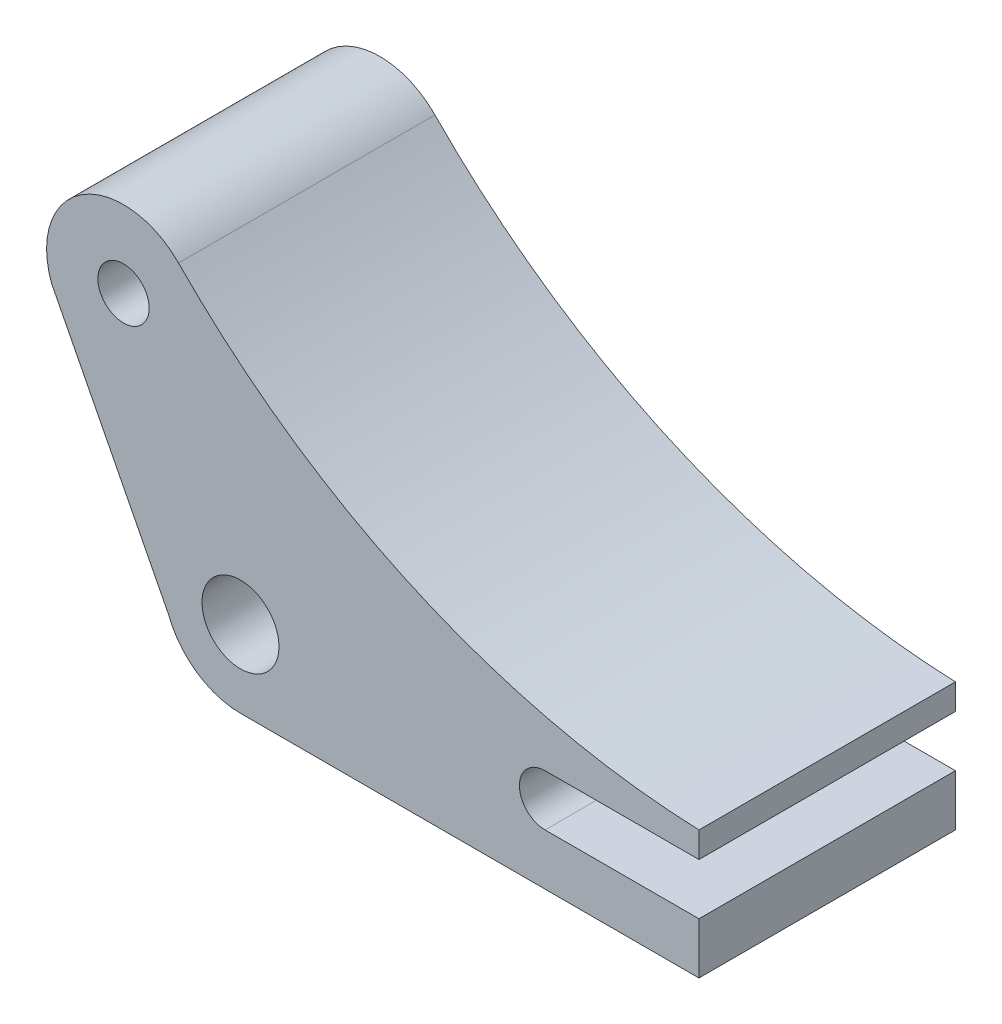
ISO-10303-21;
HEADER;
FILE_DESCRIPTION(('STEP AP214'),'2;1');
FILE_NAME('part.step','',(''),(''),'','','');
FILE_SCHEMA(('AUTOMOTIVE_DESIGN { 1 0 10303 214 1 1 1 1 }'));
ENDSEC;
DATA;
#1=APPLICATION_CONTEXT('core data for automotive mechanical design processes');
#2=APPLICATION_PROTOCOL_DEFINITION('international standard','automotive_design',2000,#1);
#3=PRODUCT_CONTEXT('',#1,'mechanical');
#4=PRODUCT('Part','Part','',(#3));
#5=PRODUCT_RELATED_PRODUCT_CATEGORY('part','',(#4));
#6=PRODUCT_DEFINITION_FORMATION('','',#4);
#7=PRODUCT_DEFINITION_CONTEXT('part definition',#1,'design');
#8=PRODUCT_DEFINITION('design','',#6,#7);
#9=PRODUCT_DEFINITION_SHAPE('','',#8);
#10=(LENGTH_UNIT() NAMED_UNIT(*) SI_UNIT(.MILLI.,.METRE.));
#11=(NAMED_UNIT(*) PLANE_ANGLE_UNIT() SI_UNIT($,.RADIAN.));
#12=(NAMED_UNIT(*) SI_UNIT($,.STERADIAN.) SOLID_ANGLE_UNIT());
#13=UNCERTAINTY_MEASURE_WITH_UNIT(LENGTH_MEASURE(1.E-05),#10,'distance_accuracy_value','');
#14=(GEOMETRIC_REPRESENTATION_CONTEXT(3) GLOBAL_UNCERTAINTY_ASSIGNED_CONTEXT((#13)) GLOBAL_UNIT_ASSIGNED_CONTEXT((#10,
#11,#12)) REPRESENTATION_CONTEXT('',''));
#15=CARTESIAN_POINT('',(0.,0.,0.));
#16=DIRECTION('',(0.,0.,1.));
#17=DIRECTION('',(1.,0.,0.));
#18=AXIS2_PLACEMENT_3D('',#15,#16,#17);
#19=CARTESIAN_POINT('',(190.2604220826,319.779554442761,50.));
#20=DIRECTION('',(0.,0.,-1.));
#21=DIRECTION('',(-1.,0.,0.));
#22=AXIS2_PLACEMENT_3D('',#19,#20,#21);
#23=CYLINDRICAL_SURFACE('',#22,300.);
#24=CARTESIAN_POINT('',(190.2604220826,319.779554442761,-50.));
#25=DIRECTION('',(0.,0.,1.));
#26=DIRECTION('',(1.,0.,0.));
#27=AXIS2_PLACEMENT_3D('',#24,#25,#26);
#28=CIRCLE('',#27,300.);
#29=CARTESIAN_POINT('',(-24.1706258147925,109.971724041639,-50.));
#30=VERTEX_POINT('',#29);
#31=CARTESIAN_POINT('',(178.761781375989,20.,-50.));
#32=VERTEX_POINT('',#31);
#33=EDGE_CURVE('E175',#30,#32,#28,.T.);
#34=ORIENTED_EDGE('',*,*,#33,.F.);
#35=DIRECTION('',(0.,0.,-1.));
#36=VECTOR('',#35,1.);
#37=CARTESIAN_POINT('',(-24.1706258147925,109.971724041639,50.));
#38=LINE('',#37,#36);
#39=CARTESIAN_POINT('',(-24.1706258147925,109.971724041639,50.));
#40=VERTEX_POINT('',#39);
#41=EDGE_CURVE('E11',#40,#30,#38,.T.);
#42=ORIENTED_EDGE('',*,*,#41,.F.);
#43=CARTESIAN_POINT('',(190.2604220826,319.779554442761,50.));
#44=DIRECTION('',(0.,0.,1.));
#45=DIRECTION('',(1.,0.,0.));
#46=AXIS2_PLACEMENT_3D('',#43,#44,#45);
#47=CIRCLE('',#46,300.);
#48=CARTESIAN_POINT('',(178.761781375989,20.,50.));
#49=VERTEX_POINT('',#48);
#50=EDGE_CURVE('E256',#40,#49,#47,.T.);
#51=ORIENTED_EDGE('',*,*,#50,.T.);
#52=DIRECTION('',(0.,0.,-1.));
#53=VECTOR('',#52,1.);
#54=CARTESIAN_POINT('',(178.761781375989,20.,50.));
#55=LINE('',#54,#53);
#56=EDGE_CURVE('E98',#49,#32,#55,.T.);
#57=ORIENTED_EDGE('',*,*,#56,.T.);
#58=EDGE_LOOP('',(#34,#42,#51,#57));
#59=FACE_BOUND('',#58,.T.);
#60=ADVANCED_FACE('F41',(#59),#23,.F.);
#61=CARTESIAN_POINT('',(-45.6137306045318,88.9909410015267,50.));
#62=DIRECTION('',(0.,0.,-1.));
#63=DIRECTION('',(-1.,0.,0.));
#64=AXIS2_PLACEMENT_3D('',#61,#62,#63);
#65=CYLINDRICAL_SURFACE('',#64,30.);
#66=CARTESIAN_POINT('',(-45.6137306045318,88.9909410015267,-50.));
#67=DIRECTION('',(0.,0.,1.));
#68=DIRECTION('',(1.,0.,0.));
#69=AXIS2_PLACEMENT_3D('',#66,#67,#68);
#70=CIRCLE('',#69,30.);
#71=CARTESIAN_POINT('',(-73.630323726117,78.2638486713774,-50.));
#72=VERTEX_POINT('',#71);
#73=EDGE_CURVE('E173',#30,#72,#70,.T.);
#74=ORIENTED_EDGE('',*,*,#73,.T.);
#75=DIRECTION('',(0.,0.,-1.));
#76=VECTOR('',#75,1.);
#77=CARTESIAN_POINT('',(-73.630323726117,78.2638486713774,50.));
#78=LINE('',#77,#76);
#79=CARTESIAN_POINT('',(-73.630323726117,78.2638486713774,50.));
#80=VERTEX_POINT('',#79);
#81=EDGE_CURVE('E50',#80,#72,#78,.T.);
#82=ORIENTED_EDGE('',*,*,#81,.F.);
#83=CARTESIAN_POINT('',(-45.6137306045318,88.9909410015267,50.));
#84=DIRECTION('',(0.,0.,1.));
#85=DIRECTION('',(1.,0.,0.));
#86=AXIS2_PLACEMENT_3D('',#83,#84,#85);
#87=CIRCLE('',#86,30.);
#88=EDGE_CURVE('E258',#40,#80,#87,.T.);
#89=ORIENTED_EDGE('',*,*,#88,.F.);
#90=ORIENTED_EDGE('',*,*,#41,.T.);
#91=EDGE_LOOP('',(#74,#82,#89,#90));
#92=FACE_BOUND('',#91,.T.);
#93=ADVANCED_FACE('F174',(#92),#65,.T.);
#94=CARTESIAN_POINT('',(-26.5417767292878,-13.6044123128735,50.));
#95=DIRECTION('',(-0.889909410015267,-0.456137306045318,0.));
#96=DIRECTION('',(0.456137306045318,-0.889909410015267,0.));
#97=AXIS2_PLACEMENT_3D('',#94,#95,#96);
#98=PLANE('',#97);
#99=DIRECTION('',(-0.456137306045318,0.889909410015267,0.));
#100=VECTOR('',#99,1.);
#101=CARTESIAN_POINT('',(-26.5417767292878,-13.6044123128735,-50.));
#102=LINE('',#101,#100);
#103=CARTESIAN_POINT('',(-28.0165931215852,-10.7270923301491,-50.));
#104=VERTEX_POINT('',#103);
#105=EDGE_CURVE('E167',#104,#72,#102,.T.);
#106=ORIENTED_EDGE('',*,*,#105,.F.);
#107=DIRECTION('',(0.,0.,-1.));
#108=VECTOR('',#107,1.);
#109=CARTESIAN_POINT('',(-28.0165931215852,-10.7270923301491,50.));
#110=LINE('',#109,#108);
#111=CARTESIAN_POINT('',(-28.0165931215852,-10.7270923301491,50.));
#112=VERTEX_POINT('',#111);
#113=EDGE_CURVE('E159',#112,#104,#110,.T.);
#114=ORIENTED_EDGE('',*,*,#113,.F.);
#115=DIRECTION('',(-0.456137306045318,0.889909410015267,0.));
#116=VECTOR('',#115,1.);
#117=CARTESIAN_POINT('',(-26.5417767292878,-13.6044123128735,50.));
#118=LINE('',#117,#116);
#119=EDGE_CURVE('E170',#112,#80,#118,.T.);
#120=ORIENTED_EDGE('',*,*,#119,.T.);
#121=ORIENTED_EDGE('',*,*,#81,.T.);
#122=EDGE_LOOP('',(#106,#114,#120,#121));
#123=FACE_BOUND('',#122,.T.);
#124=ADVANCED_FACE('F165',(#123),#98,.T.);
#125=CARTESIAN_POINT('',(0.,0.,50.));
#126=DIRECTION('',(0.,0.,-1.));
#127=DIRECTION('',(-1.,0.,0.));
#128=AXIS2_PLACEMENT_3D('',#125,#126,#127);
#129=CYLINDRICAL_SURFACE('',#128,30.);
#130=CARTESIAN_POINT('',(0.,0.,-50.));
#131=DIRECTION('',(0.,0.,1.));
#132=DIRECTION('',(1.,0.,0.));
#133=AXIS2_PLACEMENT_3D('',#130,#131,#132);
#134=CIRCLE('',#133,30.);
#135=CARTESIAN_POINT('',(0.,-30.,-50.));
#136=VERTEX_POINT('',#135);
#137=EDGE_CURVE('E181',#136,#104,#134,.F.);
#138=ORIENTED_EDGE('',*,*,#137,.F.);
#139=DIRECTION('',(0.,0.,-1.));
#140=VECTOR('',#139,1.);
#141=CARTESIAN_POINT('',(0.,-30.,50.));
#142=LINE('',#141,#140);
#143=CARTESIAN_POINT('',(0.,-30.,50.));
#144=VERTEX_POINT('',#143);
#145=EDGE_CURVE('E157',#144,#136,#142,.T.);
#146=ORIENTED_EDGE('',*,*,#145,.F.);
#147=CARTESIAN_POINT('',(0.,0.,50.));
#148=DIRECTION('',(0.,0.,1.));
#149=DIRECTION('',(1.,0.,0.));
#150=AXIS2_PLACEMENT_3D('',#147,#148,#149);
#151=CIRCLE('',#150,30.);
#152=EDGE_CURVE('E263',#144,#112,#151,.F.);
#153=ORIENTED_EDGE('',*,*,#152,.T.);
#154=ORIENTED_EDGE('',*,*,#113,.T.);
#155=EDGE_LOOP('',(#138,#146,#153,#154));
#156=FACE_BOUND('',#155,.T.);
#157=ADVANCED_FACE('F219',(#156),#129,.T.);
#158=CARTESIAN_POINT('',(0.,-30.,50.));
#159=DIRECTION('',(0.,1.,0.));
#160=DIRECTION('',(0.,0.,1.));
#161=AXIS2_PLACEMENT_3D('',#158,#159,#160);
#162=PLANE('',#161);
#163=DIRECTION('',(1.,0.,0.));
#164=VECTOR('',#163,1.);
#165=CARTESIAN_POINT('',(0.,-30.,-50.));
#166=LINE('',#165,#164);
#167=CARTESIAN_POINT('',(178.761781375989,-30.,-50.));
#168=VERTEX_POINT('',#167);
#169=EDGE_CURVE('E183',#136,#168,#166,.T.);
#170=ORIENTED_EDGE('',*,*,#169,.T.);
#171=DIRECTION('',(0.,0.,-1.));
#172=VECTOR('',#171,1.);
#173=CARTESIAN_POINT('',(178.761781375989,-30.,50.));
#174=LINE('',#173,#172);
#175=CARTESIAN_POINT('',(178.761781375989,-30.,50.));
#176=VERTEX_POINT('',#175);
#177=EDGE_CURVE('E154',#176,#168,#174,.T.);
#178=ORIENTED_EDGE('',*,*,#177,.F.);
#179=DIRECTION('',(1.,0.,0.));
#180=VECTOR('',#179,1.);
#181=CARTESIAN_POINT('',(0.,-30.,50.));
#182=LINE('',#181,#180);
#183=EDGE_CURVE('E266',#144,#176,#182,.T.);
#184=ORIENTED_EDGE('',*,*,#183,.F.);
#185=ORIENTED_EDGE('',*,*,#145,.T.);
#186=EDGE_LOOP('',(#170,#178,#184,#185));
#187=FACE_BOUND('',#186,.T.);
#188=ADVANCED_FACE('F222',(#187),#162,.F.);
#189=CARTESIAN_POINT('',(178.761781375989,0.,50.));
#190=DIRECTION('',(-1.,0.,0.));
#191=DIRECTION('',(0.,0.,1.));
#192=AXIS2_PLACEMENT_3D('',#189,#190,#191);
#193=PLANE('',#192);
#194=DIRECTION('',(0.,1.,0.));
#195=VECTOR('',#194,1.);
#196=CARTESIAN_POINT('',(178.761781375989,0.,-50.));
#197=LINE('',#196,#195);
#198=CARTESIAN_POINT('',(178.761781375989,-10.,-50.));
#199=VERTEX_POINT('',#198);
#200=EDGE_CURVE('E189',#168,#199,#197,.T.);
#201=ORIENTED_EDGE('',*,*,#200,.T.);
#202=DIRECTION('',(0.,0.,-1.));
#203=VECTOR('',#202,1.);
#204=CARTESIAN_POINT('',(178.761781375989,-10.,50.));
#205=LINE('',#204,#203);
#206=CARTESIAN_POINT('',(178.761781375989,-10.,50.));
#207=VERTEX_POINT('',#206);
#208=EDGE_CURVE('E147',#207,#199,#205,.T.);
#209=ORIENTED_EDGE('',*,*,#208,.F.);
#210=DIRECTION('',(0.,1.,0.));
#211=VECTOR('',#210,1.);
#212=CARTESIAN_POINT('',(178.761781375989,0.,50.));
#213=LINE('',#212,#211);
#214=EDGE_CURVE('E269',#176,#207,#213,.T.);
#215=ORIENTED_EDGE('',*,*,#214,.F.);
#216=ORIENTED_EDGE('',*,*,#177,.T.);
#217=EDGE_LOOP('',(#201,#209,#215,#216));
#218=FACE_BOUND('',#217,.T.);
#219=ADVANCED_FACE('F226',(#218),#193,.F.);
#220=CARTESIAN_POINT('',(0.,-10.,50.));
#221=DIRECTION('',(0.,-1.,0.));
#222=DIRECTION('',(1.,0.,0.));
#223=AXIS2_PLACEMENT_3D('',#220,#221,#222);
#224=PLANE('',#223);
#225=DIRECTION('',(-1.,0.,0.));
#226=VECTOR('',#225,1.);
#227=CARTESIAN_POINT('',(0.,-10.,-50.));
#228=LINE('',#227,#226);
#229=CARTESIAN_POINT('',(118.761781375989,-10.,-50.));
#230=VERTEX_POINT('',#229);
#231=EDGE_CURVE('E192',#199,#230,#228,.T.);
#232=ORIENTED_EDGE('',*,*,#231,.T.);
#233=DIRECTION('',(0.,0.,-1.));
#234=VECTOR('',#233,1.);
#235=CARTESIAN_POINT('',(118.761781375989,-10.,50.));
#236=LINE('',#235,#234);
#237=CARTESIAN_POINT('',(118.761781375989,-10.,50.));
#238=VERTEX_POINT('',#237);
#239=EDGE_CURVE('E145',#238,#230,#236,.T.);
#240=ORIENTED_EDGE('',*,*,#239,.F.);
#241=DIRECTION('',(-1.,0.,0.));
#242=VECTOR('',#241,1.);
#243=CARTESIAN_POINT('',(0.,-10.,50.));
#244=LINE('',#243,#242);
#245=EDGE_CURVE('E138',#207,#238,#244,.T.);
#246=ORIENTED_EDGE('',*,*,#245,.F.);
#247=ORIENTED_EDGE('',*,*,#208,.T.);
#248=EDGE_LOOP('',(#232,#240,#246,#247));
#249=FACE_BOUND('',#248,.T.);
#250=ADVANCED_FACE('F230',(#249),#224,.F.);
#251=CARTESIAN_POINT('',(118.761781375989,0.,50.));
#252=DIRECTION('',(0.,0.,-1.));
#253=DIRECTION('',(-1.,0.,0.));
#254=AXIS2_PLACEMENT_3D('',#251,#252,#253);
#255=CYLINDRICAL_SURFACE('',#254,10.);
#256=CARTESIAN_POINT('',(118.761781375989,0.,-50.));
#257=DIRECTION('',(0.,0.,1.));
#258=DIRECTION('',(1.,0.,0.));
#259=AXIS2_PLACEMENT_3D('',#256,#257,#258);
#260=CIRCLE('',#259,10.);
#261=CARTESIAN_POINT('',(118.761781375989,9.99999999999999,-50.));
#262=VERTEX_POINT('',#261);
#263=EDGE_CURVE('E144',#230,#262,#260,.F.);
#264=ORIENTED_EDGE('',*,*,#263,.T.);
#265=DIRECTION('',(0.,0.,-1.));
#266=VECTOR('',#265,1.);
#267=CARTESIAN_POINT('',(118.761781375989,9.99999999999999,50.));
#268=LINE('',#267,#266);
#269=CARTESIAN_POINT('',(118.761781375989,9.99999999999999,50.));
#270=VERTEX_POINT('',#269);
#271=EDGE_CURVE('E129',#270,#262,#268,.T.);
#272=ORIENTED_EDGE('',*,*,#271,.F.);
#273=CARTESIAN_POINT('',(118.761781375989,0.,50.));
#274=DIRECTION('',(0.,0.,1.));
#275=DIRECTION('',(1.,0.,0.));
#276=AXIS2_PLACEMENT_3D('',#273,#274,#275);
#277=CIRCLE('',#276,10.);
#278=EDGE_CURVE('E132',#238,#270,#277,.F.);
#279=ORIENTED_EDGE('',*,*,#278,.F.);
#280=ORIENTED_EDGE('',*,*,#239,.T.);
#281=EDGE_LOOP('',(#264,#272,#279,#280));
#282=FACE_BOUND('',#281,.T.);
#283=ADVANCED_FACE('F143',(#282),#255,.F.);
#284=CARTESIAN_POINT('',(0.,9.99999999999998,50.));
#285=DIRECTION('',(0.,1.,0.));
#286=DIRECTION('',(-1.,0.,0.));
#287=AXIS2_PLACEMENT_3D('',#284,#285,#286);
#288=PLANE('',#287);
#289=DIRECTION('',(1.,0.,0.));
#290=VECTOR('',#289,1.);
#291=CARTESIAN_POINT('',(0.,9.99999999999998,-50.));
#292=LINE('',#291,#290);
#293=CARTESIAN_POINT('',(178.761781375989,10.,-50.));
#294=VERTEX_POINT('',#293);
#295=EDGE_CURVE('E196',#262,#294,#292,.T.);
#296=ORIENTED_EDGE('',*,*,#295,.T.);
#297=DIRECTION('',(0.,0.,-1.));
#298=VECTOR('',#297,1.);
#299=CARTESIAN_POINT('',(178.761781375989,10.,50.));
#300=LINE('',#299,#298);
#301=CARTESIAN_POINT('',(178.761781375989,10.,50.));
#302=VERTEX_POINT('',#301);
#303=EDGE_CURVE('E131',#302,#294,#300,.T.);
#304=ORIENTED_EDGE('',*,*,#303,.F.);
#305=DIRECTION('',(1.,0.,0.));
#306=VECTOR('',#305,1.);
#307=CARTESIAN_POINT('',(0.,9.99999999999998,50.));
#308=LINE('',#307,#306);
#309=EDGE_CURVE('E124',#270,#302,#308,.T.);
#310=ORIENTED_EDGE('',*,*,#309,.F.);
#311=ORIENTED_EDGE('',*,*,#271,.T.);
#312=EDGE_LOOP('',(#296,#304,#310,#311));
#313=FACE_BOUND('',#312,.T.);
#314=ADVANCED_FACE('F127',(#313),#288,.F.);
#315=CARTESIAN_POINT('',(178.761781375989,0.,50.));
#316=DIRECTION('',(-1.,0.,0.));
#317=DIRECTION('',(0.,0.,1.));
#318=AXIS2_PLACEMENT_3D('',#315,#316,#317);
#319=PLANE('',#318);
#320=DIRECTION('',(0.,1.,0.));
#321=VECTOR('',#320,1.);
#322=CARTESIAN_POINT('',(178.761781375989,0.,-50.));
#323=LINE('',#322,#321);
#324=EDGE_CURVE('E91',#294,#32,#323,.T.);
#325=ORIENTED_EDGE('',*,*,#324,.T.);
#326=ORIENTED_EDGE('',*,*,#56,.F.);
#327=DIRECTION('',(0.,1.,0.));
#328=VECTOR('',#327,1.);
#329=CARTESIAN_POINT('',(178.761781375989,0.,50.));
#330=LINE('',#329,#328);
#331=EDGE_CURVE('E58',#302,#49,#330,.T.);
#332=ORIENTED_EDGE('',*,*,#331,.F.);
#333=ORIENTED_EDGE('',*,*,#303,.T.);
#334=EDGE_LOOP('',(#325,#326,#332,#333));
#335=FACE_BOUND('',#334,.T.);
#336=ADVANCED_FACE('F239',(#335),#319,.F.);
#337=CARTESIAN_POINT('',(-45.6137306045318,88.9909410015267,50.));
#338=DIRECTION('',(0.,0.,-1.));
#339=DIRECTION('',(-1.,0.,0.));
#340=AXIS2_PLACEMENT_3D('',#337,#338,#339);
#341=CYLINDRICAL_SURFACE('',#340,10.);
#342=CARTESIAN_POINT('',(-45.6137306045318,88.9909410015267,50.));
#343=DIRECTION('',(0.,0.,1.));
#344=DIRECTION('',(1.,0.,0.));
#345=AXIS2_PLACEMENT_3D('',#342,#343,#344);
#346=CIRCLE('',#345,10.);
#347=CARTESIAN_POINT('',(-35.6137306045318,88.9909410015267,50.));
#348=VERTEX_POINT('',#347);
#349=EDGE_CURVE('E201',#348,#348,#346,.T.);
#350=ORIENTED_EDGE('',*,*,#349,.T.);
#351=EDGE_LOOP('',(#350));
#352=FACE_BOUND('',#351,.T.);
#353=CARTESIAN_POINT('',(-45.6137306045318,88.9909410015267,-50.));
#354=DIRECTION('',(0.,0.,1.));
#355=DIRECTION('',(1.,0.,0.));
#356=AXIS2_PLACEMENT_3D('',#353,#354,#355);
#357=CIRCLE('',#356,10.);
#358=CARTESIAN_POINT('',(-35.6137306045318,88.9909410015267,-50.));
#359=VERTEX_POINT('',#358);
#360=EDGE_CURVE('E209',#359,#359,#357,.T.);
#361=ORIENTED_EDGE('',*,*,#360,.F.);
#362=EDGE_LOOP('',(#361));
#363=FACE_BOUND('',#362,.T.);
#364=ADVANCED_FACE('F43',(#352,#363),#341,.F.);
#365=CARTESIAN_POINT('',(0.,0.,50.));
#366=DIRECTION('',(0.,0.,-1.));
#367=DIRECTION('',(-1.,0.,0.));
#368=AXIS2_PLACEMENT_3D('',#365,#366,#367);
#369=CYLINDRICAL_SURFACE('',#368,15.);
#370=CARTESIAN_POINT('',(0.,0.,50.));
#371=DIRECTION('',(0.,0.,1.));
#372=DIRECTION('',(1.,0.,0.));
#373=AXIS2_PLACEMENT_3D('',#370,#371,#372);
#374=CIRCLE('',#373,15.);
#375=CARTESIAN_POINT('',(15.,0.,50.));
#376=VERTEX_POINT('',#375);
#377=EDGE_CURVE('E202',#376,#376,#374,.T.);
#378=ORIENTED_EDGE('',*,*,#377,.T.);
#379=EDGE_LOOP('',(#378));
#380=FACE_BOUND('',#379,.T.);
#381=CARTESIAN_POINT('',(0.,0.,-50.));
#382=DIRECTION('',(0.,0.,1.));
#383=DIRECTION('',(1.,0.,0.));
#384=AXIS2_PLACEMENT_3D('',#381,#382,#383);
#385=CIRCLE('',#384,15.);
#386=CARTESIAN_POINT('',(15.,0.,-50.));
#387=VERTEX_POINT('',#386);
#388=EDGE_CURVE('E199',#387,#387,#385,.T.);
#389=ORIENTED_EDGE('',*,*,#388,.F.);
#390=EDGE_LOOP('',(#389));
#391=FACE_BOUND('',#390,.T.);
#392=ADVANCED_FACE('F243',(#380,#391),#369,.F.);
#393=CARTESIAN_POINT('',(0.,0.,50.));
#394=DIRECTION('',(0.,0.,1.));
#395=DIRECTION('',(1.,0.,0.));
#396=AXIS2_PLACEMENT_3D('',#393,#394,#395);
#397=PLANE('',#396);
#398=ORIENTED_EDGE('',*,*,#349,.F.);
#399=EDGE_LOOP('',(#398));
#400=FACE_BOUND('',#399,.T.);
#401=ORIENTED_EDGE('',*,*,#50,.F.);
#402=ORIENTED_EDGE('',*,*,#88,.T.);
#403=ORIENTED_EDGE('',*,*,#119,.F.);
#404=ORIENTED_EDGE('',*,*,#152,.F.);
#405=ORIENTED_EDGE('',*,*,#183,.T.);
#406=ORIENTED_EDGE('',*,*,#214,.T.);
#407=ORIENTED_EDGE('',*,*,#245,.T.);
#408=ORIENTED_EDGE('',*,*,#278,.T.);
#409=ORIENTED_EDGE('',*,*,#309,.T.);
#410=ORIENTED_EDGE('',*,*,#331,.T.);
#411=EDGE_LOOP('',(#401,#402,#403,#404,#405,#406,#407,#408,#409,#410));
#412=FACE_BOUND('',#411,.T.);
#413=ORIENTED_EDGE('',*,*,#377,.F.);
#414=EDGE_LOOP('',(#413));
#415=FACE_BOUND('',#414,.T.);
#416=ADVANCED_FACE('F135',(#400,#412,#415),#397,.T.);
#417=CARTESIAN_POINT('',(0.,0.,-50.));
#418=DIRECTION('',(0.,0.,1.));
#419=DIRECTION('',(1.,0.,0.));
#420=AXIS2_PLACEMENT_3D('',#417,#418,#419);
#421=PLANE('',#420);
#422=ORIENTED_EDGE('',*,*,#360,.T.);
#423=EDGE_LOOP('',(#422));
#424=FACE_BOUND('',#423,.T.);
#425=ORIENTED_EDGE('',*,*,#33,.T.);
#426=ORIENTED_EDGE('',*,*,#324,.F.);
#427=ORIENTED_EDGE('',*,*,#295,.F.);
#428=ORIENTED_EDGE('',*,*,#263,.F.);
#429=ORIENTED_EDGE('',*,*,#231,.F.);
#430=ORIENTED_EDGE('',*,*,#200,.F.);
#431=ORIENTED_EDGE('',*,*,#169,.F.);
#432=ORIENTED_EDGE('',*,*,#137,.T.);
#433=ORIENTED_EDGE('',*,*,#105,.T.);
#434=ORIENTED_EDGE('',*,*,#73,.F.);
#435=EDGE_LOOP('',(#425,#426,#427,#428,#429,#430,#431,#432,#433,#434));
#436=FACE_BOUND('',#435,.T.);
#437=ORIENTED_EDGE('',*,*,#388,.T.);
#438=EDGE_LOOP('',(#437));
#439=FACE_BOUND('',#438,.T.);
#440=ADVANCED_FACE('F177',(#424,#436,#439),#421,.F.);
#441=CLOSED_SHELL('',(#60,#93,#124,#157,#188,#219,#250,#283,#314,#336,#364,#392,#416,#440));
#442=MANIFOLD_SOLID_BREP('B2',#441);
#443=ADVANCED_BREP_SHAPE_REPRESENTATION('',(#18,#442),#14);
#444=SHAPE_DEFINITION_REPRESENTATION(#9,#443);
ENDSEC;
END-ISO-10303-21;
